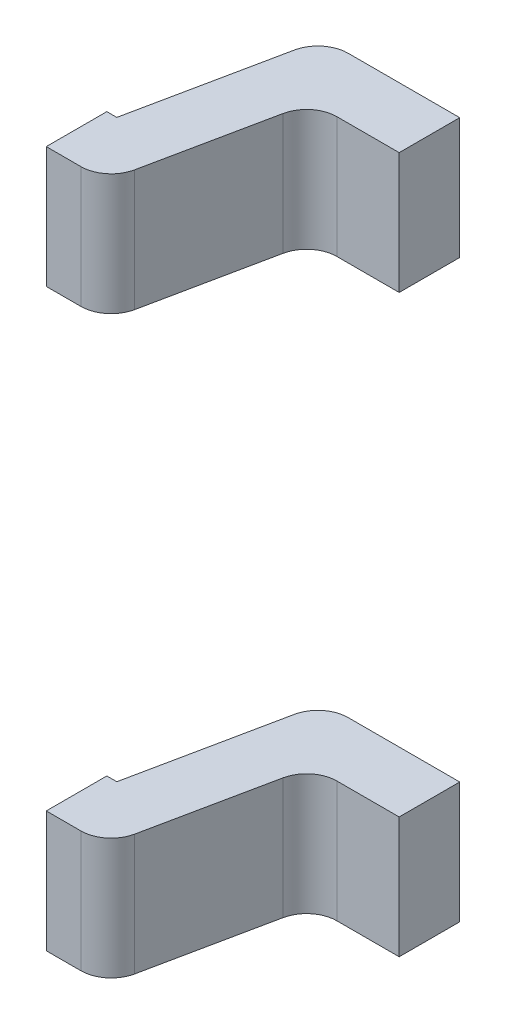
ISO-10303-21;
HEADER;
FILE_DESCRIPTION(('STEP AP214'),'2;1');
FILE_NAME('part.step','',(''),(''),'','','');
FILE_SCHEMA(('AUTOMOTIVE_DESIGN { 1 0 10303 214 1 1 1 1 }'));
ENDSEC;
DATA;
#1=APPLICATION_CONTEXT('core data for automotive mechanical design processes');
#2=APPLICATION_PROTOCOL_DEFINITION('international standard','automotive_design',2000,#1);
#3=PRODUCT_CONTEXT('',#1,'mechanical');
#4=PRODUCT('Part','Part','',(#3));
#5=PRODUCT_RELATED_PRODUCT_CATEGORY('part','',(#4));
#6=PRODUCT_DEFINITION_FORMATION('','',#4);
#7=PRODUCT_DEFINITION_CONTEXT('part definition',#1,'design');
#8=PRODUCT_DEFINITION('design','',#6,#7);
#9=PRODUCT_DEFINITION_SHAPE('','',#8);
#10=(LENGTH_UNIT() NAMED_UNIT(*) SI_UNIT(.MILLI.,.METRE.));
#11=(NAMED_UNIT(*) PLANE_ANGLE_UNIT() SI_UNIT($,.RADIAN.));
#12=(NAMED_UNIT(*) SI_UNIT($,.STERADIAN.) SOLID_ANGLE_UNIT());
#13=UNCERTAINTY_MEASURE_WITH_UNIT(LENGTH_MEASURE(1.E-05),#10,'distance_accuracy_value','');
#14=(GEOMETRIC_REPRESENTATION_CONTEXT(3) GLOBAL_UNCERTAINTY_ASSIGNED_CONTEXT((#13)) GLOBAL_UNIT_ASSIGNED_CONTEXT((#10,
#11,#12)) REPRESENTATION_CONTEXT('',''));
#15=CARTESIAN_POINT('',(0.,0.,0.));
#16=DIRECTION('',(0.,0.,1.));
#17=DIRECTION('',(1.,0.,0.));
#18=AXIS2_PLACEMENT_3D('',#15,#16,#17);
#19=CARTESIAN_POINT('',(0.91442385704,0.75,0.665521120807));
#20=DIRECTION('',(0.,1.,0.));
#21=DIRECTION('',(0.979260419507089,0.,0.202605604036018));
#22=AXIS2_PLACEMENT_3D('',#19,#20,#21);
#23=CYLINDRICAL_SURFACE('',#22,0.1);
#24=DIRECTION('',(0.,1.,0.));
#25=VECTOR('',#24,1.);
#26=CARTESIAN_POINT('',(1.01234989899,0.75,0.685781681211));
#27=LINE('',#26,#25);
#28=CARTESIAN_POINT('',(1.01234989899,0.75,0.685781681211));
#29=VERTEX_POINT('',#28);
#30=CARTESIAN_POINT('',(1.01234989899,1.15,0.685781681211));
#31=VERTEX_POINT('',#30);
#32=EDGE_CURVE('P0_E27',#29,#31,#27,.T.);
#33=ORIENTED_EDGE('',*,*,#32,.T.);
#34=CARTESIAN_POINT('',(0.91442385704,1.15,0.665521120807));
#35=DIRECTION('',(0.,-1.,0.));
#36=DIRECTION('',(0.,0.,1.));
#37=AXIS2_PLACEMENT_3D('',#34,#35,#36);
#38=CIRCLE('',#37,0.1);
#39=CARTESIAN_POINT('',(0.91442385704,1.15,0.765521120807));
#40=VERTEX_POINT('',#39);
#41=EDGE_CURVE('P0_E175',#31,#40,#38,.T.);
#42=ORIENTED_EDGE('',*,*,#41,.T.);
#43=DIRECTION('',(0.,1.,0.));
#44=VECTOR('',#43,1.);
#45=CARTESIAN_POINT('',(0.91442385704,0.75,0.765521120807));
#46=LINE('',#45,#44);
#47=CARTESIAN_POINT('',(0.91442385704,0.75,0.765521120807));
#48=VERTEX_POINT('',#47);
#49=EDGE_CURVE('P0_E11',#48,#40,#46,.T.);
#50=ORIENTED_EDGE('',*,*,#49,.F.);
#51=CARTESIAN_POINT('',(0.91442385704,0.75,0.665521120807));
#52=DIRECTION('',(0.,-1.,0.));
#53=DIRECTION('',(0.,0.,1.));
#54=AXIS2_PLACEMENT_3D('',#51,#52,#53);
#55=CIRCLE('',#54,0.1);
#56=EDGE_CURVE('P0_E199',#29,#48,#55,.T.);
#57=ORIENTED_EDGE('',*,*,#56,.F.);
#58=EDGE_LOOP('',(#33,#42,#50,#57));
#59=FACE_BOUND('',#58,.T.);
#60=ADVANCED_FACE('P0_F16',(#59),#23,.T.);
#61=CARTESIAN_POINT('',(0.8,0.75,0.765521120807));
#62=DIRECTION('',(0.,0.,1.));
#63=DIRECTION('',(1.,0.,0.));
#64=AXIS2_PLACEMENT_3D('',#61,#62,#63);
#65=PLANE('',#64);
#66=DIRECTION('',(1.,0.,0.));
#67=VECTOR('',#66,1.);
#68=CARTESIAN_POINT('',(0.8,1.15,0.765521120807));
#69=LINE('',#68,#67);
#70=CARTESIAN_POINT('',(0.8,1.15,0.765521120807));
#71=VERTEX_POINT('',#70);
#72=EDGE_CURVE('P0_E189',#71,#40,#69,.T.);
#73=ORIENTED_EDGE('',*,*,#72,.F.);
#74=DIRECTION('',(0.,1.,0.));
#75=VECTOR('',#74,1.);
#76=CARTESIAN_POINT('',(0.8,0.75,0.765521120807));
#77=LINE('',#76,#75);
#78=CARTESIAN_POINT('',(0.8,0.75,0.765521120807));
#79=VERTEX_POINT('',#78);
#80=EDGE_CURVE('P0_E194',#79,#71,#77,.T.);
#81=ORIENTED_EDGE('',*,*,#80,.F.);
#82=DIRECTION('',(1.,0.,0.));
#83=VECTOR('',#82,1.);
#84=CARTESIAN_POINT('',(0.8,0.75,0.765521120807));
#85=LINE('',#84,#83);
#86=EDGE_CURVE('P0_E203',#79,#48,#85,.T.);
#87=ORIENTED_EDGE('',*,*,#86,.T.);
#88=ORIENTED_EDGE('',*,*,#49,.T.);
#89=EDGE_LOOP('',(#73,#81,#87,#88));
#90=FACE_BOUND('',#89,.T.);
#91=ADVANCED_FACE('P0_F324',(#90),#65,.T.);
#92=CARTESIAN_POINT('',(1.145852083901,0.75,0.04052112080719));
#93=DIRECTION('',(0.979260419507089,0.,0.202605604036018));
#94=DIRECTION('',(0.,-1.,0.));
#95=AXIS2_PLACEMENT_3D('',#92,#93,#94);
#96=PLANE('',#95);
#97=DIRECTION('',(-0.202605604036018,0.,0.979260419507089));
#98=VECTOR('',#97,1.);
#99=CARTESIAN_POINT('',(1.145852083901,0.75,0.04052112080719));
#100=LINE('',#99,#98);
#101=CARTESIAN_POINT('',(1.096358638635,0.75,0.279739439596));
#102=VERTEX_POINT('',#101);
#103=EDGE_CURVE('P0_E204',#102,#29,#100,.T.);
#104=ORIENTED_EDGE('',*,*,#103,.F.);
#105=DIRECTION('',(0.,1.,0.));
#106=VECTOR('',#105,1.);
#107=CARTESIAN_POINT('',(1.096358638635,0.75,0.279739439596));
#108=LINE('',#107,#106);
#109=CARTESIAN_POINT('',(1.096358638635,1.15,0.279739439596));
#110=VERTEX_POINT('',#109);
#111=EDGE_CURVE('P0_E71',#102,#110,#108,.T.);
#112=ORIENTED_EDGE('',*,*,#111,.T.);
#113=DIRECTION('',(-0.202605604036018,0.,0.979260419507089));
#114=VECTOR('',#113,1.);
#115=CARTESIAN_POINT('',(1.145852083901,1.15,0.04052112080719));
#116=LINE('',#115,#114);
#117=EDGE_CURVE('P0_E138',#110,#31,#116,.T.);
#118=ORIENTED_EDGE('',*,*,#117,.T.);
#119=ORIENTED_EDGE('',*,*,#32,.F.);
#120=EDGE_LOOP('',(#104,#112,#118,#119));
#121=FACE_BOUND('',#120,.T.);
#122=ADVANCED_FACE('P0_F316',(#121),#96,.T.);
#123=CARTESIAN_POINT('',(0.8,0.75,0.565521120807));
#124=DIRECTION('',(1.,0.,0.));
#125=DIRECTION('',(0.,1.,0.));
#126=AXIS2_PLACEMENT_3D('',#123,#124,#125);
#127=PLANE('',#126);
#128=DIRECTION('',(0.,0.,1.));
#129=VECTOR('',#128,1.);
#130=CARTESIAN_POINT('',(0.8,0.75,0.565521120807));
#131=LINE('',#130,#129);
#132=CARTESIAN_POINT('',(0.8,0.75,0.565521120807));
#133=VERTEX_POINT('',#132);
#134=EDGE_CURVE('P0_E185',#133,#79,#131,.T.);
#135=ORIENTED_EDGE('',*,*,#134,.T.);
#136=ORIENTED_EDGE('',*,*,#80,.T.);
#137=DIRECTION('',(0.,0.,1.));
#138=VECTOR('',#137,1.);
#139=CARTESIAN_POINT('',(0.8,1.15,0.565521120807));
#140=LINE('',#139,#138);
#141=CARTESIAN_POINT('',(0.8,1.15,0.565521120807));
#142=VERTEX_POINT('',#141);
#143=EDGE_CURVE('P0_E180',#142,#71,#140,.T.);
#144=ORIENTED_EDGE('',*,*,#143,.F.);
#145=DIRECTION('',(0.,1.,0.));
#146=VECTOR('',#145,1.);
#147=CARTESIAN_POINT('',(0.8,0.75,0.565521120807));
#148=LINE('',#147,#146);
#149=EDGE_CURVE('P0_E198',#133,#142,#148,.T.);
#150=ORIENTED_EDGE('',*,*,#149,.F.);
#151=EDGE_LOOP('',(#135,#136,#144,#150));
#152=FACE_BOUND('',#151,.T.);
#153=ADVANCED_FACE('P0_F277',(#152),#127,.F.);
#154=CARTESIAN_POINT('',(0.8,0.75,0.565521120807));
#155=DIRECTION('',(0.,0.,1.));
#156=DIRECTION('',(1.,0.,0.));
#157=AXIS2_PLACEMENT_3D('',#154,#155,#156);
#158=PLANE('',#157);
#159=DIRECTION('',(0.,1.,0.));
#160=VECTOR('',#159,1.);
#161=CARTESIAN_POINT('',(0.832995630178,0.75,0.565521120807));
#162=LINE('',#161,#160);
#163=CARTESIAN_POINT('',(0.832995630178,0.75,0.565521120807));
#164=VERTEX_POINT('',#163);
#165=CARTESIAN_POINT('',(0.832995630178,1.15,0.565521120807));
#166=VERTEX_POINT('',#165);
#167=EDGE_CURVE('P0_E214',#164,#166,#162,.T.);
#168=ORIENTED_EDGE('',*,*,#167,.F.);
#169=DIRECTION('',(1.,0.,0.));
#170=VECTOR('',#169,1.);
#171=CARTESIAN_POINT('',(0.8,0.75,0.565521120807));
#172=LINE('',#171,#170);
#173=EDGE_CURVE('P0_E181',#133,#164,#172,.T.);
#174=ORIENTED_EDGE('',*,*,#173,.F.);
#175=ORIENTED_EDGE('',*,*,#149,.T.);
#176=DIRECTION('',(1.,0.,0.));
#177=VECTOR('',#176,1.);
#178=CARTESIAN_POINT('',(0.8,1.15,0.565521120807));
#179=LINE('',#178,#177);
#180=EDGE_CURVE('P0_E176',#142,#166,#179,.T.);
#181=ORIENTED_EDGE('',*,*,#180,.T.);
#182=EDGE_LOOP('',(#168,#174,#175,#181));
#183=FACE_BOUND('',#182,.T.);
#184=ADVANCED_FACE('P0_F271',(#183),#158,.F.);
#185=CARTESIAN_POINT('',(0.95,0.75,0.));
#186=DIRECTION('',(0.979260419507089,0.,0.202605604036018));
#187=DIRECTION('',(0.,-1.,0.));
#188=AXIS2_PLACEMENT_3D('',#185,#186,#187);
#189=PLANE('',#188);
#190=ORIENTED_EDGE('',*,*,#167,.T.);
#191=DIRECTION('',(-0.202605604036018,0.,0.979260419507089));
#192=VECTOR('',#191,1.);
#193=CARTESIAN_POINT('',(0.95,1.15,0.));
#194=LINE('',#193,#192);
#195=CARTESIAN_POINT('',(0.933502184911,1.15,0.0797394395964));
#196=VERTEX_POINT('',#195);
#197=EDGE_CURVE('P0_E171',#196,#166,#194,.T.);
#198=ORIENTED_EDGE('',*,*,#197,.F.);
#199=DIRECTION('',(0.,1.,0.));
#200=VECTOR('',#199,1.);
#201=CARTESIAN_POINT('',(0.933502184911,0.75,0.0797394395964));
#202=LINE('',#201,#200);
#203=CARTESIAN_POINT('',(0.933502184911,0.75,0.0797394395964));
#204=VERTEX_POINT('',#203);
#205=EDGE_CURVE('P0_E218',#204,#196,#202,.T.);
#206=ORIENTED_EDGE('',*,*,#205,.F.);
#207=DIRECTION('',(-0.202605604036018,0.,0.979260419507089));
#208=VECTOR('',#207,1.);
#209=CARTESIAN_POINT('',(0.95,0.75,0.));
#210=LINE('',#209,#208);
#211=EDGE_CURVE('P0_E162',#204,#164,#210,.T.);
#212=ORIENTED_EDGE('',*,*,#211,.T.);
#213=EDGE_LOOP('',(#190,#198,#206,#212));
#214=FACE_BOUND('',#213,.T.);
#215=ADVANCED_FACE('P0_F18',(#214),#189,.F.);
#216=CARTESIAN_POINT('',(1.031428226862,0.75,0.1));
#217=DIRECTION('',(0.,1.,0.));
#218=DIRECTION('',(0.,0.,-1.));
#219=AXIS2_PLACEMENT_3D('',#216,#217,#218);
#220=CYLINDRICAL_SURFACE('',#219,0.1);
#221=CARTESIAN_POINT('',(1.031428226862,0.75,0.1));
#222=DIRECTION('',(0.,1.,0.));
#223=DIRECTION('',(0.,0.,1.));
#224=AXIS2_PLACEMENT_3D('',#221,#222,#223);
#225=CIRCLE('',#224,0.1);
#226=CARTESIAN_POINT('',(1.031428226862,0.75,0.));
#227=VERTEX_POINT('',#226);
#228=EDGE_CURVE('P0_E193',#227,#204,#225,.T.);
#229=ORIENTED_EDGE('',*,*,#228,.T.);
#230=ORIENTED_EDGE('',*,*,#205,.T.);
#231=CARTESIAN_POINT('',(1.031428226862,1.15,0.1));
#232=DIRECTION('',(0.,1.,0.));
#233=DIRECTION('',(0.,0.,1.));
#234=AXIS2_PLACEMENT_3D('',#231,#232,#233);
#235=CIRCLE('',#234,0.1);
#236=CARTESIAN_POINT('',(1.031428226862,1.15,0.));
#237=VERTEX_POINT('',#236);
#238=EDGE_CURVE('P0_E167',#237,#196,#235,.T.);
#239=ORIENTED_EDGE('',*,*,#238,.F.);
#240=DIRECTION('',(0.,1.,0.));
#241=VECTOR('',#240,1.);
#242=CARTESIAN_POINT('',(1.031428226862,0.75,0.));
#243=LINE('',#242,#241);
#244=EDGE_CURVE('P0_E41',#227,#237,#243,.T.);
#245=ORIENTED_EDGE('',*,*,#244,.F.);
#246=EDGE_LOOP('',(#229,#230,#239,#245));
#247=FACE_BOUND('',#246,.T.);
#248=ADVANCED_FACE('P0_F261',(#247),#220,.T.);
#249=CARTESIAN_POINT('',(0.95,0.75,0.));
#250=DIRECTION('',(0.,0.,1.));
#251=DIRECTION('',(1.,0.,0.));
#252=AXIS2_PLACEMENT_3D('',#249,#250,#251);
#253=PLANE('',#252);
#254=ORIENTED_EDGE('',*,*,#244,.T.);
#255=DIRECTION('',(1.,0.,0.));
#256=VECTOR('',#255,1.);
#257=CARTESIAN_POINT('',(0.95,1.15,0.));
#258=LINE('',#257,#256);
#259=CARTESIAN_POINT('',(1.4,1.15,0.));
#260=VERTEX_POINT('',#259);
#261=EDGE_CURVE('P0_E172',#237,#260,#258,.T.);
#262=ORIENTED_EDGE('',*,*,#261,.T.);
#263=DIRECTION('',(0.,1.,0.));
#264=VECTOR('',#263,1.);
#265=CARTESIAN_POINT('',(1.4,0.75,0.));
#266=LINE('',#265,#264);
#267=CARTESIAN_POINT('',(1.4,0.75,0.));
#268=VERTEX_POINT('',#267);
#269=EDGE_CURVE('P0_E226',#268,#260,#266,.T.);
#270=ORIENTED_EDGE('',*,*,#269,.F.);
#271=DIRECTION('',(1.,0.,0.));
#272=VECTOR('',#271,1.);
#273=CARTESIAN_POINT('',(0.95,0.75,0.));
#274=LINE('',#273,#272);
#275=EDGE_CURVE('P0_E190',#227,#268,#274,.T.);
#276=ORIENTED_EDGE('',*,*,#275,.F.);
#277=EDGE_LOOP('',(#254,#262,#270,#276));
#278=FACE_BOUND('',#277,.T.);
#279=ADVANCED_FACE('P0_F255',(#278),#253,.F.);
#280=CARTESIAN_POINT('',(0.95,0.75,0.));
#281=DIRECTION('',(0.,1.,0.));
#282=DIRECTION('',(1.,0.,0.));
#283=AXIS2_PLACEMENT_3D('',#280,#281,#282);
#284=PLANE('',#283);
#285=DIRECTION('',(0.,0.,1.));
#286=VECTOR('',#285,1.);
#287=CARTESIAN_POINT('',(1.4,0.75,0.));
#288=LINE('',#287,#286);
#289=CARTESIAN_POINT('',(1.4,0.75,0.2));
#290=VERTEX_POINT('',#289);
#291=EDGE_CURVE('P0_E166',#268,#290,#288,.T.);
#292=ORIENTED_EDGE('',*,*,#291,.T.);
#293=DIRECTION('',(1.,0.,0.));
#294=VECTOR('',#293,1.);
#295=CARTESIAN_POINT('',(0.95,0.75,0.2));
#296=LINE('',#295,#294);
#297=CARTESIAN_POINT('',(1.194284680585,0.75,0.2));
#298=VERTEX_POINT('',#297);
#299=EDGE_CURVE('P0_E151',#298,#290,#296,.T.);
#300=ORIENTED_EDGE('',*,*,#299,.F.);
#301=CARTESIAN_POINT('',(1.194284680585,0.75,0.3));
#302=DIRECTION('',(0.,1.,0.));
#303=DIRECTION('',(0.,0.,1.));
#304=AXIS2_PLACEMENT_3D('',#301,#302,#303);
#305=CIRCLE('',#304,0.1);
#306=EDGE_CURVE('P0_E146',#298,#102,#305,.T.);
#307=ORIENTED_EDGE('',*,*,#306,.T.);
#308=ORIENTED_EDGE('',*,*,#103,.T.);
#309=ORIENTED_EDGE('',*,*,#56,.T.);
#310=ORIENTED_EDGE('',*,*,#86,.F.);
#311=ORIENTED_EDGE('',*,*,#134,.F.);
#312=ORIENTED_EDGE('',*,*,#173,.T.);
#313=ORIENTED_EDGE('',*,*,#211,.F.);
#314=ORIENTED_EDGE('',*,*,#228,.F.);
#315=ORIENTED_EDGE('',*,*,#275,.T.);
#316=EDGE_LOOP('',(#292,#300,#307,#308,#309,#310,#311,#312,#313,#314,#315));
#317=FACE_BOUND('',#316,.T.);
#318=ADVANCED_FACE('P0_F307',(#317),#284,.F.);
#319=CARTESIAN_POINT('',(1.4,0.75,0.));
#320=DIRECTION('',(1.,0.,0.));
#321=DIRECTION('',(0.,1.,0.));
#322=AXIS2_PLACEMENT_3D('',#319,#320,#321);
#323=PLANE('',#322);
#324=ORIENTED_EDGE('',*,*,#291,.F.);
#325=ORIENTED_EDGE('',*,*,#269,.T.);
#326=DIRECTION('',(0.,0.,1.));
#327=VECTOR('',#326,1.);
#328=CARTESIAN_POINT('',(1.4,1.15,0.));
#329=LINE('',#328,#327);
#330=CARTESIAN_POINT('',(1.4,1.15,0.2));
#331=VERTEX_POINT('',#330);
#332=EDGE_CURVE('P0_E20',#260,#331,#329,.T.);
#333=ORIENTED_EDGE('',*,*,#332,.T.);
#334=DIRECTION('',(0.,1.,0.));
#335=VECTOR('',#334,1.);
#336=CARTESIAN_POINT('',(1.4,0.75,0.2));
#337=LINE('',#336,#335);
#338=EDGE_CURVE('P0_E154',#290,#331,#337,.T.);
#339=ORIENTED_EDGE('',*,*,#338,.F.);
#340=EDGE_LOOP('',(#324,#325,#333,#339));
#341=FACE_BOUND('',#340,.T.);
#342=ADVANCED_FACE('P0_F251',(#341),#323,.T.);
#343=CARTESIAN_POINT('',(1.194284680585,0.75,0.3));
#344=DIRECTION('',(0.,1.,0.));
#345=DIRECTION('',(0.,0.,-1.));
#346=AXIS2_PLACEMENT_3D('',#343,#344,#345);
#347=CYLINDRICAL_SURFACE('',#346,0.1);
#348=DIRECTION('',(0.,1.,0.));
#349=VECTOR('',#348,1.);
#350=CARTESIAN_POINT('',(1.194284680585,0.75,0.2));
#351=LINE('',#350,#349);
#352=CARTESIAN_POINT('',(1.194284680585,1.15,0.2));
#353=VERTEX_POINT('',#352);
#354=EDGE_CURVE('P0_E143',#298,#353,#351,.T.);
#355=ORIENTED_EDGE('',*,*,#354,.T.);
#356=CARTESIAN_POINT('',(1.194284680585,1.15,0.3));
#357=DIRECTION('',(0.,1.,0.));
#358=DIRECTION('',(0.,0.,1.));
#359=AXIS2_PLACEMENT_3D('',#356,#357,#358);
#360=CIRCLE('',#359,0.1);
#361=EDGE_CURVE('P0_E131',#353,#110,#360,.T.);
#362=ORIENTED_EDGE('',*,*,#361,.T.);
#363=ORIENTED_EDGE('',*,*,#111,.F.);
#364=ORIENTED_EDGE('',*,*,#306,.F.);
#365=EDGE_LOOP('',(#355,#362,#363,#364));
#366=FACE_BOUND('',#365,.T.);
#367=ADVANCED_FACE('P0_F144',(#366),#347,.F.);
#368=CARTESIAN_POINT('',(0.95,1.15,0.));
#369=DIRECTION('',(0.,1.,0.));
#370=DIRECTION('',(1.,0.,0.));
#371=AXIS2_PLACEMENT_3D('',#368,#369,#370);
#372=PLANE('',#371);
#373=ORIENTED_EDGE('',*,*,#261,.F.);
#374=ORIENTED_EDGE('',*,*,#238,.T.);
#375=ORIENTED_EDGE('',*,*,#197,.T.);
#376=ORIENTED_EDGE('',*,*,#180,.F.);
#377=ORIENTED_EDGE('',*,*,#143,.T.);
#378=ORIENTED_EDGE('',*,*,#72,.T.);
#379=ORIENTED_EDGE('',*,*,#41,.F.);
#380=ORIENTED_EDGE('',*,*,#117,.F.);
#381=ORIENTED_EDGE('',*,*,#361,.F.);
#382=DIRECTION('',(1.,0.,0.));
#383=VECTOR('',#382,1.);
#384=CARTESIAN_POINT('',(0.95,1.15,0.2));
#385=LINE('',#384,#383);
#386=EDGE_CURVE('P0_E136',#353,#331,#385,.T.);
#387=ORIENTED_EDGE('',*,*,#386,.T.);
#388=ORIENTED_EDGE('',*,*,#332,.F.);
#389=EDGE_LOOP('',(#373,#374,#375,#376,#377,#378,#379,#380,#381,#387,#388));
#390=FACE_BOUND('',#389,.T.);
#391=ADVANCED_FACE('P0_F134',(#390),#372,.T.);
#392=CARTESIAN_POINT('',(0.95,0.75,0.2));
#393=DIRECTION('',(0.,0.,1.));
#394=DIRECTION('',(1.,0.,0.));
#395=AXIS2_PLACEMENT_3D('',#392,#393,#394);
#396=PLANE('',#395);
#397=ORIENTED_EDGE('',*,*,#386,.F.);
#398=ORIENTED_EDGE('',*,*,#354,.F.);
#399=ORIENTED_EDGE('',*,*,#299,.T.);
#400=ORIENTED_EDGE('',*,*,#338,.T.);
#401=EDGE_LOOP('',(#397,#398,#399,#400));
#402=FACE_BOUND('',#401,.T.);
#403=ADVANCED_FACE('P0_F153',(#402),#396,.T.);
#404=CLOSED_SHELL('',(#60,#91,#122,#153,#184,#215,#248,#279,#318,#342,#367,#391,#403));
#405=MANIFOLD_SOLID_BREP('P0_B1',#404);
#406=CARTESIAN_POINT('',(0.91442385704,-1.15,0.665521120807));
#407=DIRECTION('',(0.,1.,0.));
#408=DIRECTION('',(0.979260419507089,0.,0.202605604036018));
#409=AXIS2_PLACEMENT_3D('',#406,#407,#408);
#410=CYLINDRICAL_SURFACE('',#409,0.1);
#411=DIRECTION('',(0.,1.,0.));
#412=VECTOR('',#411,1.);
#413=CARTESIAN_POINT('',(1.01234989899,-1.15,0.685781681211));
#414=LINE('',#413,#412);
#415=CARTESIAN_POINT('',(1.01234989899,-1.15,0.685781681211));
#416=VERTEX_POINT('',#415);
#417=CARTESIAN_POINT('',(1.01234989899,-0.75,0.685781681211));
#418=VERTEX_POINT('',#417);
#419=EDGE_CURVE('P1_E27',#416,#418,#414,.T.);
#420=ORIENTED_EDGE('',*,*,#419,.T.);
#421=CARTESIAN_POINT('',(0.91442385704,-0.75,0.665521120807));
#422=DIRECTION('',(0.,-1.,0.));
#423=DIRECTION('',(0.,0.,1.));
#424=AXIS2_PLACEMENT_3D('',#421,#422,#423);
#425=CIRCLE('',#424,0.1);
#426=CARTESIAN_POINT('',(0.91442385704,-0.75,0.765521120807));
#427=VERTEX_POINT('',#426);
#428=EDGE_CURVE('P1_E153',#418,#427,#425,.T.);
#429=ORIENTED_EDGE('',*,*,#428,.T.);
#430=DIRECTION('',(0.,1.,0.));
#431=VECTOR('',#430,1.);
#432=CARTESIAN_POINT('',(0.91442385704,-1.15,0.765521120807));
#433=LINE('',#432,#431);
#434=CARTESIAN_POINT('',(0.91442385704,-1.15,0.765521120807));
#435=VERTEX_POINT('',#434);
#436=EDGE_CURVE('P1_E11',#435,#427,#433,.T.);
#437=ORIENTED_EDGE('',*,*,#436,.F.);
#438=CARTESIAN_POINT('',(0.91442385704,-1.15,0.665521120807));
#439=DIRECTION('',(0.,-1.,0.));
#440=DIRECTION('',(0.,0.,1.));
#441=AXIS2_PLACEMENT_3D('',#438,#439,#440);
#442=CIRCLE('',#441,0.1);
#443=EDGE_CURVE('P1_E172',#416,#435,#442,.T.);
#444=ORIENTED_EDGE('',*,*,#443,.F.);
#445=EDGE_LOOP('',(#420,#429,#437,#444));
#446=FACE_BOUND('',#445,.T.);
#447=ADVANCED_FACE('P1_F16',(#446),#410,.T.);
#448=CARTESIAN_POINT('',(0.8,-1.15,0.765521120807));
#449=DIRECTION('',(0.,0.,1.));
#450=DIRECTION('',(1.,0.,0.));
#451=AXIS2_PLACEMENT_3D('',#448,#449,#450);
#452=PLANE('',#451);
#453=DIRECTION('',(1.,0.,0.));
#454=VECTOR('',#453,1.);
#455=CARTESIAN_POINT('',(0.8,-0.75,0.765521120807));
#456=LINE('',#455,#454);
#457=CARTESIAN_POINT('',(0.8,-0.75,0.765521120807));
#458=VERTEX_POINT('',#457);
#459=EDGE_CURVE('P1_E160',#458,#427,#456,.T.);
#460=ORIENTED_EDGE('',*,*,#459,.F.);
#461=DIRECTION('',(0.,1.,0.));
#462=VECTOR('',#461,1.);
#463=CARTESIAN_POINT('',(0.8,-1.15,0.765521120807));
#464=LINE('',#463,#462);
#465=CARTESIAN_POINT('',(0.8,-1.15,0.765521120807));
#466=VERTEX_POINT('',#465);
#467=EDGE_CURVE('P1_E164',#466,#458,#464,.T.);
#468=ORIENTED_EDGE('',*,*,#467,.F.);
#469=DIRECTION('',(1.,0.,0.));
#470=VECTOR('',#469,1.);
#471=CARTESIAN_POINT('',(0.8,-1.15,0.765521120807));
#472=LINE('',#471,#470);
#473=EDGE_CURVE('P1_E329',#466,#435,#472,.T.);
#474=ORIENTED_EDGE('',*,*,#473,.T.);
#475=ORIENTED_EDGE('',*,*,#436,.T.);
#476=EDGE_LOOP('',(#460,#468,#474,#475));
#477=FACE_BOUND('',#476,.T.);
#478=ADVANCED_FACE('P1_F378',(#477),#452,.T.);
#479=CARTESIAN_POINT('',(1.145852083901,-1.15,0.04052112080719));
#480=DIRECTION('',(0.979260419507089,0.,0.202605604036018));
#481=DIRECTION('',(0.,-1.,0.));
#482=AXIS2_PLACEMENT_3D('',#479,#480,#481);
#483=PLANE('',#482);
#484=DIRECTION('',(-0.202605604036018,0.,0.979260419507089));
#485=VECTOR('',#484,1.);
#486=CARTESIAN_POINT('',(1.145852083901,-1.15,0.04052112080719));
#487=LINE('',#486,#485);
#488=CARTESIAN_POINT('',(1.096358638635,-1.15,0.279739439596));
#489=VERTEX_POINT('',#488);
#490=EDGE_CURVE('P1_E137',#489,#416,#487,.T.);
#491=ORIENTED_EDGE('',*,*,#490,.F.);
#492=DIRECTION('',(0.,1.,0.));
#493=VECTOR('',#492,1.);
#494=CARTESIAN_POINT('',(1.096358638635,-1.15,0.279739439596));
#495=LINE('',#494,#493);
#496=CARTESIAN_POINT('',(1.096358638635,-0.75,0.279739439596));
#497=VERTEX_POINT('',#496);
#498=EDGE_CURVE('P1_E131',#489,#497,#495,.T.);
#499=ORIENTED_EDGE('',*,*,#498,.T.);
#500=DIRECTION('',(-0.202605604036018,0.,0.979260419507089));
#501=VECTOR('',#500,1.);
#502=CARTESIAN_POINT('',(1.145852083901,-0.75,0.04052112080719));
#503=LINE('',#502,#501);
#504=EDGE_CURVE('P1_E134',#497,#418,#503,.T.);
#505=ORIENTED_EDGE('',*,*,#504,.T.);
#506=ORIENTED_EDGE('',*,*,#419,.F.);
#507=EDGE_LOOP('',(#491,#499,#505,#506));
#508=FACE_BOUND('',#507,.T.);
#509=ADVANCED_FACE('P1_F132',(#508),#483,.T.);
#510=CARTESIAN_POINT('',(0.8,-1.15,0.565521120807));
#511=DIRECTION('',(1.,0.,0.));
#512=DIRECTION('',(0.,1.,0.));
#513=AXIS2_PLACEMENT_3D('',#510,#511,#512);
#514=PLANE('',#513);
#515=DIRECTION('',(0.,0.,1.));
#516=VECTOR('',#515,1.);
#517=CARTESIAN_POINT('',(0.8,-1.15,0.565521120807));
#518=LINE('',#517,#516);
#519=CARTESIAN_POINT('',(0.8,-1.15,0.565521120807));
#520=VERTEX_POINT('',#519);
#521=EDGE_CURVE('P1_E185',#520,#466,#518,.T.);
#522=ORIENTED_EDGE('',*,*,#521,.T.);
#523=ORIENTED_EDGE('',*,*,#467,.T.);
#524=DIRECTION('',(0.,0.,1.));
#525=VECTOR('',#524,1.);
#526=CARTESIAN_POINT('',(0.8,-0.75,0.565521120807));
#527=LINE('',#526,#525);
#528=CARTESIAN_POINT('',(0.8,-0.75,0.565521120807));
#529=VERTEX_POINT('',#528);
#530=EDGE_CURVE('P1_E285',#529,#458,#527,.T.);
#531=ORIENTED_EDGE('',*,*,#530,.F.);
#532=DIRECTION('',(0.,1.,0.));
#533=VECTOR('',#532,1.);
#534=CARTESIAN_POINT('',(0.8,-1.15,0.565521120807));
#535=LINE('',#534,#533);
#536=EDGE_CURVE('P1_E193',#520,#529,#535,.T.);
#537=ORIENTED_EDGE('',*,*,#536,.F.);
#538=EDGE_LOOP('',(#522,#523,#531,#537));
#539=FACE_BOUND('',#538,.T.);
#540=ADVANCED_FACE('P1_F18',(#539),#514,.F.);
#541=CARTESIAN_POINT('',(0.8,-1.15,0.565521120807));
#542=DIRECTION('',(0.,0.,1.));
#543=DIRECTION('',(1.,0.,0.));
#544=AXIS2_PLACEMENT_3D('',#541,#542,#543);
#545=PLANE('',#544);
#546=DIRECTION('',(0.,1.,0.));
#547=VECTOR('',#546,1.);
#548=CARTESIAN_POINT('',(0.832995630178,-1.15,0.565521120807));
#549=LINE('',#548,#547);
#550=CARTESIAN_POINT('',(0.832995630178,-1.15,0.565521120807));
#551=VERTEX_POINT('',#550);
#552=CARTESIAN_POINT('',(0.832995630178,-0.75,0.565521120807));
#553=VERTEX_POINT('',#552);
#554=EDGE_CURVE('P1_E191',#551,#553,#549,.T.);
#555=ORIENTED_EDGE('',*,*,#554,.F.);
#556=DIRECTION('',(1.,0.,0.));
#557=VECTOR('',#556,1.);
#558=CARTESIAN_POINT('',(0.8,-1.15,0.565521120807));
#559=LINE('',#558,#557);
#560=EDGE_CURVE('P1_E181',#520,#551,#559,.T.);
#561=ORIENTED_EDGE('',*,*,#560,.F.);
#562=ORIENTED_EDGE('',*,*,#536,.T.);
#563=DIRECTION('',(1.,0.,0.));
#564=VECTOR('',#563,1.);
#565=CARTESIAN_POINT('',(0.8,-0.75,0.565521120807));
#566=LINE('',#565,#564);
#567=EDGE_CURVE('P1_E204',#529,#553,#566,.T.);
#568=ORIENTED_EDGE('',*,*,#567,.T.);
#569=EDGE_LOOP('',(#555,#561,#562,#568));
#570=FACE_BOUND('',#569,.T.);
#571=ADVANCED_FACE('P1_F368',(#570),#545,.F.);
#572=CARTESIAN_POINT('',(0.95,-1.15,0.));
#573=DIRECTION('',(0.979260419507089,0.,0.202605604036018));
#574=DIRECTION('',(0.,-1.,0.));
#575=AXIS2_PLACEMENT_3D('',#572,#573,#574);
#576=PLANE('',#575);
#577=ORIENTED_EDGE('',*,*,#554,.T.);
#578=DIRECTION('',(-0.202605604036018,0.,0.979260419507089));
#579=VECTOR('',#578,1.);
#580=CARTESIAN_POINT('',(0.95,-0.75,0.));
#581=LINE('',#580,#579);
#582=CARTESIAN_POINT('',(0.933502184911,-0.75,0.0797394395964));
#583=VERTEX_POINT('',#582);
#584=EDGE_CURVE('P1_E201',#583,#553,#581,.T.);
#585=ORIENTED_EDGE('',*,*,#584,.F.);
#586=DIRECTION('',(0.,1.,0.));
#587=VECTOR('',#586,1.);
#588=CARTESIAN_POINT('',(0.933502184911,-1.15,0.0797394395964));
#589=LINE('',#588,#587);
#590=CARTESIAN_POINT('',(0.933502184911,-1.15,0.0797394395964));
#591=VERTEX_POINT('',#590);
#592=EDGE_CURVE('P1_E175',#591,#583,#589,.T.);
#593=ORIENTED_EDGE('',*,*,#592,.F.);
#594=DIRECTION('',(-0.202605604036018,0.,0.979260419507089));
#595=VECTOR('',#594,1.);
#596=CARTESIAN_POINT('',(0.95,-1.15,0.));
#597=LINE('',#596,#595);
#598=EDGE_CURVE('P1_E184',#591,#551,#597,.T.);
#599=ORIENTED_EDGE('',*,*,#598,.T.);
#600=EDGE_LOOP('',(#577,#585,#593,#599));
#601=FACE_BOUND('',#600,.T.);
#602=ADVANCED_FACE('P1_F366',(#601),#576,.F.);
#603=CARTESIAN_POINT('',(1.031428226862,-1.15,0.1));
#604=DIRECTION('',(0.,1.,0.));
#605=DIRECTION('',(0.,0.,-1.));
#606=AXIS2_PLACEMENT_3D('',#603,#604,#605);
#607=CYLINDRICAL_SURFACE('',#606,0.1);
#608=CARTESIAN_POINT('',(1.031428226862,-1.15,0.1));
#609=DIRECTION('',(0.,1.,0.));
#610=DIRECTION('',(0.,0.,1.));
#611=AXIS2_PLACEMENT_3D('',#608,#609,#610);
#612=CIRCLE('',#611,0.1);
#613=CARTESIAN_POINT('',(1.031428226862,-1.15,0.));
#614=VERTEX_POINT('',#613);
#615=EDGE_CURVE('P1_E190',#614,#591,#612,.T.);
#616=ORIENTED_EDGE('',*,*,#615,.T.);
#617=ORIENTED_EDGE('',*,*,#592,.T.);
#618=CARTESIAN_POINT('',(1.031428226862,-0.75,0.1));
#619=DIRECTION('',(0.,1.,0.));
#620=DIRECTION('',(0.,0.,1.));
#621=AXIS2_PLACEMENT_3D('',#618,#619,#620);
#622=CIRCLE('',#621,0.1);
#623=CARTESIAN_POINT('',(1.031428226862,-0.75,0.));
#624=VERTEX_POINT('',#623);
#625=EDGE_CURVE('P1_E205',#624,#583,#622,.T.);
#626=ORIENTED_EDGE('',*,*,#625,.F.);
#627=DIRECTION('',(0.,1.,0.));
#628=VECTOR('',#627,1.);
#629=CARTESIAN_POINT('',(1.031428226862,-1.15,0.));
#630=LINE('',#629,#628);
#631=EDGE_CURVE('P1_E41',#614,#624,#630,.T.);
#632=ORIENTED_EDGE('',*,*,#631,.F.);
#633=EDGE_LOOP('',(#616,#617,#626,#632));
#634=FACE_BOUND('',#633,.T.);
#635=ADVANCED_FACE('P1_F364',(#634),#607,.T.);
#636=CARTESIAN_POINT('',(0.95,-1.15,0.));
#637=DIRECTION('',(0.,0.,1.));
#638=DIRECTION('',(1.,0.,0.));
#639=AXIS2_PLACEMENT_3D('',#636,#637,#638);
#640=PLANE('',#639);
#641=ORIENTED_EDGE('',*,*,#631,.T.);
#642=DIRECTION('',(1.,0.,0.));
#643=VECTOR('',#642,1.);
#644=CARTESIAN_POINT('',(0.95,-0.75,0.));
#645=LINE('',#644,#643);
#646=CARTESIAN_POINT('',(1.4,-0.75,0.));
#647=VERTEX_POINT('',#646);
#648=EDGE_CURVE('P1_E260',#624,#647,#645,.T.);
#649=ORIENTED_EDGE('',*,*,#648,.T.);
#650=DIRECTION('',(0.,1.,0.));
#651=VECTOR('',#650,1.);
#652=CARTESIAN_POINT('',(1.4,-1.15,0.));
#653=LINE('',#652,#651);
#654=CARTESIAN_POINT('',(1.4,-1.15,0.));
#655=VERTEX_POINT('',#654);
#656=EDGE_CURVE('P1_E166',#655,#647,#653,.T.);
#657=ORIENTED_EDGE('',*,*,#656,.F.);
#658=DIRECTION('',(1.,0.,0.));
#659=VECTOR('',#658,1.);
#660=CARTESIAN_POINT('',(0.95,-1.15,0.));
#661=LINE('',#660,#659);
#662=EDGE_CURVE('P1_E176',#614,#655,#661,.T.);
#663=ORIENTED_EDGE('',*,*,#662,.F.);
#664=EDGE_LOOP('',(#641,#649,#657,#663));
#665=FACE_BOUND('',#664,.T.);
#666=ADVANCED_FACE('P1_F362',(#665),#640,.F.);
#667=CARTESIAN_POINT('',(0.95,-1.15,0.));
#668=DIRECTION('',(0.,1.,0.));
#669=DIRECTION('',(1.,0.,0.));
#670=AXIS2_PLACEMENT_3D('',#667,#668,#669);
#671=PLANE('',#670);
#672=DIRECTION('',(0.,0.,1.));
#673=VECTOR('',#672,1.);
#674=CARTESIAN_POINT('',(1.4,-1.15,0.));
#675=LINE('',#674,#673);
#676=CARTESIAN_POINT('',(1.4,-1.15,0.2));
#677=VERTEX_POINT('',#676);
#678=EDGE_CURVE('P1_E169',#655,#677,#675,.T.);
#679=ORIENTED_EDGE('',*,*,#678,.T.);
#680=DIRECTION('',(1.,0.,0.));
#681=VECTOR('',#680,1.);
#682=CARTESIAN_POINT('',(0.95,-1.15,0.2));
#683=LINE('',#682,#681);
#684=CARTESIAN_POINT('',(1.194284680585,-1.15,0.2));
#685=VERTEX_POINT('',#684);
#686=EDGE_CURVE('P1_E196',#685,#677,#683,.T.);
#687=ORIENTED_EDGE('',*,*,#686,.F.);
#688=CARTESIAN_POINT('',(1.194284680585,-1.15,0.3));
#689=DIRECTION('',(0.,1.,0.));
#690=DIRECTION('',(0.,0.,1.));
#691=AXIS2_PLACEMENT_3D('',#688,#689,#690);
#692=CIRCLE('',#691,0.1);
#693=EDGE_CURVE('P1_E141',#685,#489,#692,.T.);
#694=ORIENTED_EDGE('',*,*,#693,.T.);
#695=ORIENTED_EDGE('',*,*,#490,.T.);
#696=ORIENTED_EDGE('',*,*,#443,.T.);
#697=ORIENTED_EDGE('',*,*,#473,.F.);
#698=ORIENTED_EDGE('',*,*,#521,.F.);
#699=ORIENTED_EDGE('',*,*,#560,.T.);
#700=ORIENTED_EDGE('',*,*,#598,.F.);
#701=ORIENTED_EDGE('',*,*,#615,.F.);
#702=ORIENTED_EDGE('',*,*,#662,.T.);
#703=EDGE_LOOP('',(#679,#687,#694,#695,#696,#697,#698,#699,#700,#701,#702));
#704=FACE_BOUND('',#703,.T.);
#705=ADVANCED_FACE('P1_F358',(#704),#671,.F.);
#706=CARTESIAN_POINT('',(1.4,-1.15,0.));
#707=DIRECTION('',(1.,0.,0.));
#708=DIRECTION('',(0.,1.,0.));
#709=AXIS2_PLACEMENT_3D('',#706,#707,#708);
#710=PLANE('',#709);
#711=ORIENTED_EDGE('',*,*,#678,.F.);
#712=ORIENTED_EDGE('',*,*,#656,.T.);
#713=DIRECTION('',(0.,0.,1.));
#714=VECTOR('',#713,1.);
#715=CARTESIAN_POINT('',(1.4,-0.75,0.));
#716=LINE('',#715,#714);
#717=CARTESIAN_POINT('',(1.4,-0.75,0.2));
#718=VERTEX_POINT('',#717);
#719=EDGE_CURVE('P1_E111',#647,#718,#716,.T.);
#720=ORIENTED_EDGE('',*,*,#719,.T.);
#721=DIRECTION('',(0.,1.,0.));
#722=VECTOR('',#721,1.);
#723=CARTESIAN_POINT('',(1.4,-1.15,0.2));
#724=LINE('',#723,#722);
#725=EDGE_CURVE('P1_E20',#677,#718,#724,.T.);
#726=ORIENTED_EDGE('',*,*,#725,.F.);
#727=EDGE_LOOP('',(#711,#712,#720,#726));
#728=FACE_BOUND('',#727,.T.);
#729=ADVANCED_FACE('P1_F355',(#728),#710,.T.);
#730=CARTESIAN_POINT('',(1.194284680585,-1.15,0.3));
#731=DIRECTION('',(0.,1.,0.));
#732=DIRECTION('',(0.,0.,-1.));
#733=AXIS2_PLACEMENT_3D('',#730,#731,#732);
#734=CYLINDRICAL_SURFACE('',#733,0.1);
#735=DIRECTION('',(0.,1.,0.));
#736=VECTOR('',#735,1.);
#737=CARTESIAN_POINT('',(1.194284680585,-1.15,0.2));
#738=LINE('',#737,#736);
#739=CARTESIAN_POINT('',(1.194284680585,-0.75,0.2));
#740=VERTEX_POINT('',#739);
#741=EDGE_CURVE('P1_E145',#685,#740,#738,.T.);
#742=ORIENTED_EDGE('',*,*,#741,.T.);
#743=CARTESIAN_POINT('',(1.194284680585,-0.75,0.3));
#744=DIRECTION('',(0.,1.,0.));
#745=DIRECTION('',(0.,0.,1.));
#746=AXIS2_PLACEMENT_3D('',#743,#744,#745);
#747=CIRCLE('',#746,0.1);
#748=EDGE_CURVE('P1_E99',#740,#497,#747,.T.);
#749=ORIENTED_EDGE('',*,*,#748,.T.);
#750=ORIENTED_EDGE('',*,*,#498,.F.);
#751=ORIENTED_EDGE('',*,*,#693,.F.);
#752=EDGE_LOOP('',(#742,#749,#750,#751));
#753=FACE_BOUND('',#752,.T.);
#754=ADVANCED_FACE('P1_F143',(#753),#734,.F.);
#755=CARTESIAN_POINT('',(0.95,-0.75,0.));
#756=DIRECTION('',(0.,1.,0.));
#757=DIRECTION('',(1.,0.,0.));
#758=AXIS2_PLACEMENT_3D('',#755,#756,#757);
#759=PLANE('',#758);
#760=ORIENTED_EDGE('',*,*,#648,.F.);
#761=ORIENTED_EDGE('',*,*,#625,.T.);
#762=ORIENTED_EDGE('',*,*,#584,.T.);
#763=ORIENTED_EDGE('',*,*,#567,.F.);
#764=ORIENTED_EDGE('',*,*,#530,.T.);
#765=ORIENTED_EDGE('',*,*,#459,.T.);
#766=ORIENTED_EDGE('',*,*,#428,.F.);
#767=ORIENTED_EDGE('',*,*,#504,.F.);
#768=ORIENTED_EDGE('',*,*,#748,.F.);
#769=DIRECTION('',(1.,0.,0.));
#770=VECTOR('',#769,1.);
#771=CARTESIAN_POINT('',(0.95,-0.75,0.2));
#772=LINE('',#771,#770);
#773=EDGE_CURVE('P1_E197',#740,#718,#772,.T.);
#774=ORIENTED_EDGE('',*,*,#773,.T.);
#775=ORIENTED_EDGE('',*,*,#719,.F.);
#776=EDGE_LOOP('',(#760,#761,#762,#763,#764,#765,#766,#767,#768,#774,#775));
#777=FACE_BOUND('',#776,.T.);
#778=ADVANCED_FACE('P1_F150',(#777),#759,.T.);
#779=CARTESIAN_POINT('',(0.95,-1.15,0.2));
#780=DIRECTION('',(0.,0.,1.));
#781=DIRECTION('',(1.,0.,0.));
#782=AXIS2_PLACEMENT_3D('',#779,#780,#781);
#783=PLANE('',#782);
#784=ORIENTED_EDGE('',*,*,#773,.F.);
#785=ORIENTED_EDGE('',*,*,#741,.F.);
#786=ORIENTED_EDGE('',*,*,#686,.T.);
#787=ORIENTED_EDGE('',*,*,#725,.T.);
#788=EDGE_LOOP('',(#784,#785,#786,#787));
#789=FACE_BOUND('',#788,.T.);
#790=ADVANCED_FACE('P1_F352',(#789),#783,.T.);
#791=CLOSED_SHELL('',(#447,#478,#509,#540,#571,#602,#635,#666,#705,#729,#754,#778,#790));
#792=MANIFOLD_SOLID_BREP('P1_B1',#791);
#793=ADVANCED_BREP_SHAPE_REPRESENTATION('',(#18,#405,#792),#14);
#794=SHAPE_DEFINITION_REPRESENTATION(#9,#793);
ENDSEC;
END-ISO-10303-21;
